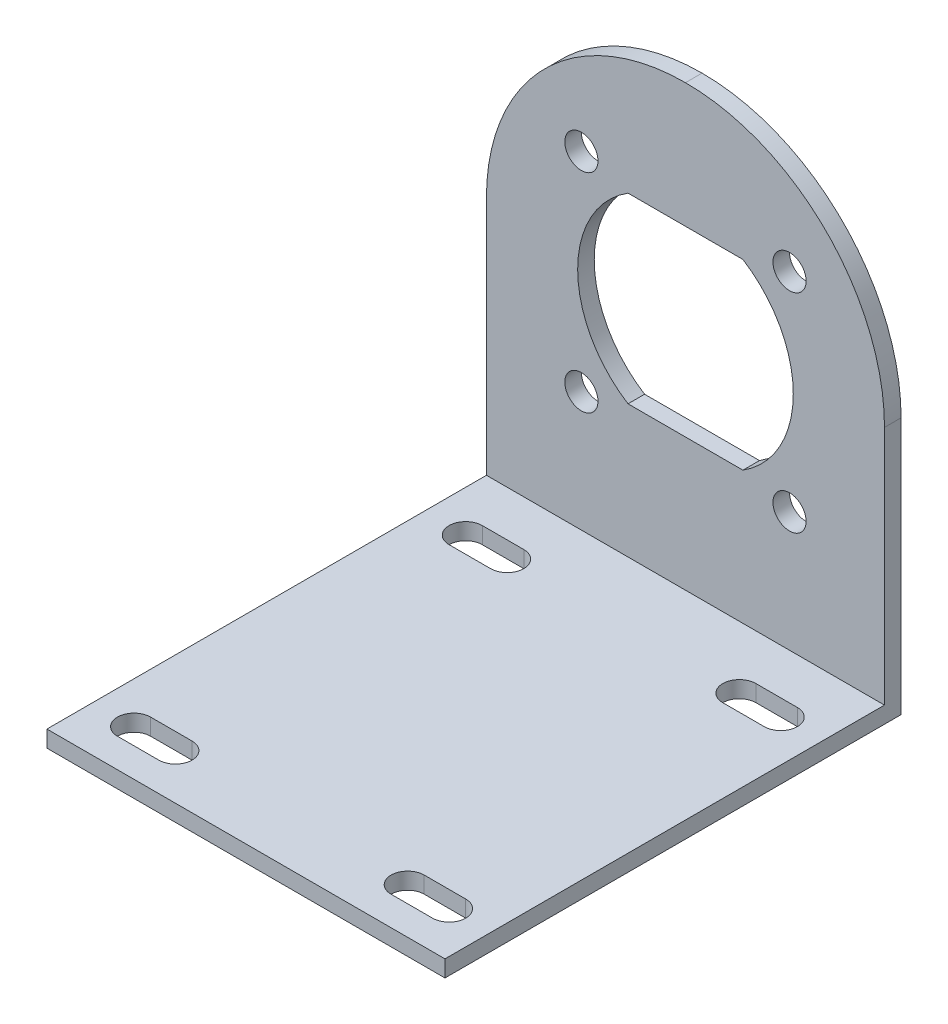
ISO-10303-21;
HEADER;
FILE_DESCRIPTION(('STEP AP214'),'2;1');
FILE_NAME('part.step','',(''),(''),'','','');
FILE_SCHEMA(('AUTOMOTIVE_DESIGN { 1 0 10303 214 1 1 1 1 }'));
ENDSEC;
DATA;
#1=APPLICATION_CONTEXT('core data for automotive mechanical design processes');
#2=APPLICATION_PROTOCOL_DEFINITION('international standard','automotive_design',2000,#1);
#3=PRODUCT_CONTEXT('',#1,'mechanical');
#4=PRODUCT('Part','Part','',(#3));
#5=PRODUCT_RELATED_PRODUCT_CATEGORY('part','',(#4));
#6=PRODUCT_DEFINITION_FORMATION('','',#4);
#7=PRODUCT_DEFINITION_CONTEXT('part definition',#1,'design');
#8=PRODUCT_DEFINITION('design','',#6,#7);
#9=PRODUCT_DEFINITION_SHAPE('','',#8);
#10=(LENGTH_UNIT() NAMED_UNIT(*) SI_UNIT(.MILLI.,.METRE.));
#11=(NAMED_UNIT(*) PLANE_ANGLE_UNIT() SI_UNIT($,.RADIAN.));
#12=(NAMED_UNIT(*) SI_UNIT($,.STERADIAN.) SOLID_ANGLE_UNIT());
#13=UNCERTAINTY_MEASURE_WITH_UNIT(LENGTH_MEASURE(1.E-05),#10,'distance_accuracy_value','');
#14=(GEOMETRIC_REPRESENTATION_CONTEXT(3) GLOBAL_UNCERTAINTY_ASSIGNED_CONTEXT((#13)) GLOBAL_UNIT_ASSIGNED_CONTEXT((#10,
#11,#12)) REPRESENTATION_CONTEXT('',''));
#15=CARTESIAN_POINT('',(0.,0.,0.));
#16=DIRECTION('',(0.,0.,1.));
#17=DIRECTION('',(1.,0.,0.));
#18=AXIS2_PLACEMENT_3D('',#15,#16,#17);
#19=CARTESIAN_POINT('',(0.,1.99999999999999,-24.));
#20=DIRECTION('',(0.,0.,-1.));
#21=DIRECTION('',(-1.,0.,0.));
#22=AXIS2_PLACEMENT_3D('',#19,#20,#21);
#23=PLANE('',#22);
#24=CARTESIAN_POINT('',(0.,29.,-24.));
#25=DIRECTION('',(0.,0.,1.));
#26=DIRECTION('',(1.,0.,0.));
#27=AXIS2_PLACEMENT_3D('',#24,#25,#26);
#28=CIRCLE('',#27,13.);
#29=CARTESIAN_POINT('',(-6.92820323027552,40.,-24.));
#30=VERTEX_POINT('',#29);
#31=CARTESIAN_POINT('',(-6.92820323027552,18.,-24.));
#32=VERTEX_POINT('',#31);
#33=EDGE_CURVE('E427',#30,#32,#28,.T.);
#34=ORIENTED_EDGE('',*,*,#33,.F.);
#35=DIRECTION('',(-1.,0.,0.));
#36=VECTOR('',#35,1.);
#37=CARTESIAN_POINT('',(0.,40.,-24.));
#38=LINE('',#37,#36);
#39=CARTESIAN_POINT('',(6.92820323027552,40.,-24.));
#40=VERTEX_POINT('',#39);
#41=EDGE_CURVE('E436',#40,#30,#38,.T.);
#42=ORIENTED_EDGE('',*,*,#41,.F.);
#43=CARTESIAN_POINT('',(0.,29.,-24.));
#44=DIRECTION('',(0.,0.,1.));
#45=DIRECTION('',(1.,0.,0.));
#46=AXIS2_PLACEMENT_3D('',#43,#44,#45);
#47=CIRCLE('',#46,13.);
#48=CARTESIAN_POINT('',(6.92820323027552,18.,-24.));
#49=VERTEX_POINT('',#48);
#50=EDGE_CURVE('E433',#49,#40,#47,.T.);
#51=ORIENTED_EDGE('',*,*,#50,.F.);
#52=DIRECTION('',(1.,0.,0.));
#53=VECTOR('',#52,1.);
#54=CARTESIAN_POINT('',(0.,18.,-24.));
#55=LINE('',#54,#53);
#56=EDGE_CURVE('E430',#32,#49,#55,.T.);
#57=ORIENTED_EDGE('',*,*,#56,.F.);
#58=EDGE_LOOP('',(#34,#42,#51,#57));
#59=FACE_BOUND('',#58,.T.);
#60=CARTESIAN_POINT('',(12.55,41.55,-24.));
#61=DIRECTION('',(0.,0.,1.));
#62=DIRECTION('',(1.,0.,0.));
#63=AXIS2_PLACEMENT_3D('',#60,#61,#62);
#64=CIRCLE('',#63,2.);
#65=CARTESIAN_POINT('',(14.55,41.55,-24.));
#66=VERTEX_POINT('',#65);
#67=EDGE_CURVE('E392',#66,#66,#64,.T.);
#68=ORIENTED_EDGE('',*,*,#67,.F.);
#69=EDGE_LOOP('',(#68));
#70=FACE_BOUND('',#69,.T.);
#71=CARTESIAN_POINT('',(-12.55,16.45,-24.));
#72=DIRECTION('',(0.,0.,1.));
#73=DIRECTION('',(1.,0.,0.));
#74=AXIS2_PLACEMENT_3D('',#71,#72,#73);
#75=CIRCLE('',#74,2.);
#76=CARTESIAN_POINT('',(-10.55,16.45,-24.));
#77=VERTEX_POINT('',#76);
#78=EDGE_CURVE('E385',#77,#77,#75,.T.);
#79=ORIENTED_EDGE('',*,*,#78,.F.);
#80=EDGE_LOOP('',(#79));
#81=FACE_BOUND('',#80,.T.);
#82=CARTESIAN_POINT('',(12.55,16.45,-24.));
#83=DIRECTION('',(0.,0.,1.));
#84=DIRECTION('',(1.,0.,0.));
#85=AXIS2_PLACEMENT_3D('',#82,#83,#84);
#86=CIRCLE('',#85,2.);
#87=CARTESIAN_POINT('',(14.55,16.45,-24.));
#88=VERTEX_POINT('',#87);
#89=EDGE_CURVE('E388',#88,#88,#86,.T.);
#90=ORIENTED_EDGE('',*,*,#89,.F.);
#91=EDGE_LOOP('',(#90));
#92=FACE_BOUND('',#91,.T.);
#93=CARTESIAN_POINT('',(-12.55,41.55,-24.));
#94=DIRECTION('',(0.,0.,1.));
#95=DIRECTION('',(1.,0.,0.));
#96=AXIS2_PLACEMENT_3D('',#93,#94,#95);
#97=CIRCLE('',#96,2.);
#98=CARTESIAN_POINT('',(-10.55,41.55,-24.));
#99=VERTEX_POINT('',#98);
#100=EDGE_CURVE('E389',#99,#99,#97,.T.);
#101=ORIENTED_EDGE('',*,*,#100,.F.);
#102=EDGE_LOOP('',(#101));
#103=FACE_BOUND('',#102,.T.);
#104=DIRECTION('',(0.,1.,0.));
#105=VECTOR('',#104,1.);
#106=CARTESIAN_POINT('',(24.,-108.,-24.));
#107=LINE('',#106,#105);
#108=CARTESIAN_POINT('',(24.,2.,-24.));
#109=VERTEX_POINT('',#108);
#110=CARTESIAN_POINT('',(24.,31.,-24.));
#111=VERTEX_POINT('',#110);
#112=EDGE_CURVE('E379',#109,#111,#107,.T.);
#113=ORIENTED_EDGE('',*,*,#112,.T.);
#114=CARTESIAN_POINT('',(0.,31.,-24.));
#115=DIRECTION('',(0.,0.,-1.));
#116=DIRECTION('',(-1.,0.,0.));
#117=AXIS2_PLACEMENT_3D('',#114,#115,#116);
#118=CIRCLE('',#117,24.);
#119=CARTESIAN_POINT('',(0.,55.,-24.));
#120=VERTEX_POINT('',#119);
#121=EDGE_CURVE('E11',#111,#120,#118,.F.);
#122=ORIENTED_EDGE('',*,*,#121,.T.);
#123=CARTESIAN_POINT('',(0.,31.,-24.));
#124=DIRECTION('',(0.,0.,-1.));
#125=DIRECTION('',(-1.,0.,0.));
#126=AXIS2_PLACEMENT_3D('',#123,#124,#125);
#127=CIRCLE('',#126,24.);
#128=CARTESIAN_POINT('',(-24.,31.,-24.));
#129=VERTEX_POINT('',#128);
#130=EDGE_CURVE('E447',#120,#129,#127,.F.);
#131=ORIENTED_EDGE('',*,*,#130,.T.);
#132=DIRECTION('',(0.,1.,0.));
#133=VECTOR('',#132,1.);
#134=CARTESIAN_POINT('',(-24.,-108.,-24.));
#135=LINE('',#134,#133);
#136=CARTESIAN_POINT('',(-24.,2.,-24.));
#137=VERTEX_POINT('',#136);
#138=EDGE_CURVE('E376',#137,#129,#135,.T.);
#139=ORIENTED_EDGE('',*,*,#138,.F.);
#140=DIRECTION('',(-1.,0.,0.));
#141=VECTOR('',#140,1.);
#142=CARTESIAN_POINT('',(-24.,2.,-24.));
#143=LINE('',#142,#141);
#144=EDGE_CURVE('E352',#109,#137,#143,.T.);
#145=ORIENTED_EDGE('',*,*,#144,.F.);
#146=EDGE_LOOP('',(#113,#122,#131,#139,#145));
#147=FACE_BOUND('',#146,.T.);
#148=ADVANCED_FACE('F33',(#59,#70,#81,#92,#103,#147),#23,.F.);
#149=CARTESIAN_POINT('',(0.,0.,0.));
#150=DIRECTION('',(0.,1.,0.));
#151=DIRECTION('',(0.,0.,1.));
#152=AXIS2_PLACEMENT_3D('',#149,#150,#151);
#153=PLANE('',#152);
#154=DIRECTION('',(1.,0.,0.));
#155=VECTOR('',#154,1.);
#156=CARTESIAN_POINT('',(0.,0.,25.5));
#157=LINE('',#156,#155);
#158=CARTESIAN_POINT('',(14.,0.,25.5));
#159=VERTEX_POINT('',#158);
#160=CARTESIAN_POINT('',(19.,0.,25.5));
#161=VERTEX_POINT('',#160);
#162=EDGE_CURVE('E346',#159,#161,#157,.T.);
#163=ORIENTED_EDGE('',*,*,#162,.T.);
#164=CARTESIAN_POINT('',(19.,0.,23.5));
#165=DIRECTION('',(0.,1.,0.));
#166=DIRECTION('',(0.,0.,1.));
#167=AXIS2_PLACEMENT_3D('',#164,#165,#166);
#168=CIRCLE('',#167,2.);
#169=CARTESIAN_POINT('',(19.,0.,21.5));
#170=VERTEX_POINT('',#169);
#171=EDGE_CURVE('E349',#161,#170,#168,.T.);
#172=ORIENTED_EDGE('',*,*,#171,.T.);
#173=DIRECTION('',(-1.,0.,0.));
#174=VECTOR('',#173,1.);
#175=CARTESIAN_POINT('',(0.,0.,21.5));
#176=LINE('',#175,#174);
#177=CARTESIAN_POINT('',(14.,0.,21.5));
#178=VERTEX_POINT('',#177);
#179=EDGE_CURVE('E340',#170,#178,#176,.T.);
#180=ORIENTED_EDGE('',*,*,#179,.T.);
#181=CARTESIAN_POINT('',(14.,0.,23.5));
#182=DIRECTION('',(0.,1.,0.));
#183=DIRECTION('',(0.,0.,1.));
#184=AXIS2_PLACEMENT_3D('',#181,#182,#183);
#185=CIRCLE('',#184,2.);
#186=EDGE_CURVE('E343',#178,#159,#185,.T.);
#187=ORIENTED_EDGE('',*,*,#186,.T.);
#188=EDGE_LOOP('',(#163,#172,#180,#187));
#189=FACE_BOUND('',#188,.T.);
#190=DIRECTION('',(-1.,0.,0.));
#191=VECTOR('',#190,1.);
#192=CARTESIAN_POINT('',(0.,0.,21.5));
#193=LINE('',#192,#191);
#194=CARTESIAN_POINT('',(-14.,0.,21.5));
#195=VERTEX_POINT('',#194);
#196=CARTESIAN_POINT('',(-19.,0.,21.5));
#197=VERTEX_POINT('',#196);
#198=EDGE_CURVE('E334',#195,#197,#193,.T.);
#199=ORIENTED_EDGE('',*,*,#198,.T.);
#200=CARTESIAN_POINT('',(-19.,0.,23.5));
#201=DIRECTION('',(0.,1.,0.));
#202=DIRECTION('',(0.,0.,1.));
#203=AXIS2_PLACEMENT_3D('',#200,#201,#202);
#204=CIRCLE('',#203,2.);
#205=CARTESIAN_POINT('',(-19.,0.,25.5));
#206=VERTEX_POINT('',#205);
#207=EDGE_CURVE('E337',#197,#206,#204,.T.);
#208=ORIENTED_EDGE('',*,*,#207,.T.);
#209=DIRECTION('',(1.,0.,0.));
#210=VECTOR('',#209,1.);
#211=CARTESIAN_POINT('',(0.,0.,25.5));
#212=LINE('',#211,#210);
#213=CARTESIAN_POINT('',(-14.,0.,25.5));
#214=VERTEX_POINT('',#213);
#215=EDGE_CURVE('E328',#206,#214,#212,.T.);
#216=ORIENTED_EDGE('',*,*,#215,.T.);
#217=CARTESIAN_POINT('',(-14.,0.,23.5));
#218=DIRECTION('',(0.,1.,0.));
#219=DIRECTION('',(0.,0.,1.));
#220=AXIS2_PLACEMENT_3D('',#217,#218,#219);
#221=CIRCLE('',#220,2.);
#222=EDGE_CURVE('E331',#214,#195,#221,.T.);
#223=ORIENTED_EDGE('',*,*,#222,.T.);
#224=EDGE_LOOP('',(#199,#208,#216,#223));
#225=FACE_BOUND('',#224,.T.);
#226=DIRECTION('',(-1.,0.,0.));
#227=VECTOR('',#226,1.);
#228=CARTESIAN_POINT('',(0.,0.,-18.5));
#229=LINE('',#228,#227);
#230=CARTESIAN_POINT('',(-14.,0.,-18.5));
#231=VERTEX_POINT('',#230);
#232=CARTESIAN_POINT('',(-19.,0.,-18.5));
#233=VERTEX_POINT('',#232);
#234=EDGE_CURVE('E322',#231,#233,#229,.T.);
#235=ORIENTED_EDGE('',*,*,#234,.T.);
#236=CARTESIAN_POINT('',(-19.,0.,-16.5));
#237=DIRECTION('',(0.,1.,0.));
#238=DIRECTION('',(0.,0.,1.));
#239=AXIS2_PLACEMENT_3D('',#236,#237,#238);
#240=CIRCLE('',#239,1.99999999999999);
#241=CARTESIAN_POINT('',(-19.,0.,-14.5));
#242=VERTEX_POINT('',#241);
#243=EDGE_CURVE('E325',#233,#242,#240,.T.);
#244=ORIENTED_EDGE('',*,*,#243,.T.);
#245=DIRECTION('',(1.,0.,0.));
#246=VECTOR('',#245,1.);
#247=CARTESIAN_POINT('',(0.,0.,-14.5));
#248=LINE('',#247,#246);
#249=CARTESIAN_POINT('',(-14.,0.,-14.5));
#250=VERTEX_POINT('',#249);
#251=EDGE_CURVE('E319',#242,#250,#248,.T.);
#252=ORIENTED_EDGE('',*,*,#251,.T.);
#253=CARTESIAN_POINT('',(-14.,0.,-16.5));
#254=DIRECTION('',(0.,1.,0.));
#255=DIRECTION('',(0.,0.,1.));
#256=AXIS2_PLACEMENT_3D('',#253,#254,#255);
#257=CIRCLE('',#256,1.99999999999999);
#258=EDGE_CURVE('E220',#250,#231,#257,.T.);
#259=ORIENTED_EDGE('',*,*,#258,.T.);
#260=EDGE_LOOP('',(#235,#244,#252,#259));
#261=FACE_BOUND('',#260,.T.);
#262=DIRECTION('',(1.,0.,0.));
#263=VECTOR('',#262,1.);
#264=CARTESIAN_POINT('',(0.,0.,-14.5));
#265=LINE('',#264,#263);
#266=CARTESIAN_POINT('',(14.,0.,-14.5));
#267=VERTEX_POINT('',#266);
#268=CARTESIAN_POINT('',(19.,0.,-14.5));
#269=VERTEX_POINT('',#268);
#270=EDGE_CURVE('E313',#267,#269,#265,.T.);
#271=ORIENTED_EDGE('',*,*,#270,.T.);
#272=CARTESIAN_POINT('',(19.,0.,-16.5));
#273=DIRECTION('',(0.,1.,0.));
#274=DIRECTION('',(0.,0.,1.));
#275=AXIS2_PLACEMENT_3D('',#272,#273,#274);
#276=CIRCLE('',#275,1.99999999999999);
#277=CARTESIAN_POINT('',(19.,0.,-18.5));
#278=VERTEX_POINT('',#277);
#279=EDGE_CURVE('E316',#269,#278,#276,.T.);
#280=ORIENTED_EDGE('',*,*,#279,.T.);
#281=DIRECTION('',(-1.,0.,0.));
#282=VECTOR('',#281,1.);
#283=CARTESIAN_POINT('',(0.,0.,-18.5));
#284=LINE('',#283,#282);
#285=CARTESIAN_POINT('',(14.,0.,-18.5));
#286=VERTEX_POINT('',#285);
#287=EDGE_CURVE('E301',#278,#286,#284,.T.);
#288=ORIENTED_EDGE('',*,*,#287,.T.);
#289=CARTESIAN_POINT('',(14.,0.,-16.5));
#290=DIRECTION('',(0.,1.,0.));
#291=DIRECTION('',(0.,0.,1.));
#292=AXIS2_PLACEMENT_3D('',#289,#290,#291);
#293=CIRCLE('',#292,1.99999999999999);
#294=EDGE_CURVE('E310',#286,#267,#293,.T.);
#295=ORIENTED_EDGE('',*,*,#294,.T.);
#296=EDGE_LOOP('',(#271,#280,#288,#295));
#297=FACE_BOUND('',#296,.T.);
#298=DIRECTION('',(0.,0.,1.));
#299=VECTOR('',#298,1.);
#300=CARTESIAN_POINT('',(-24.,0.,0.));
#301=LINE('',#300,#299);
#302=CARTESIAN_POINT('',(-24.,0.,-26.));
#303=VERTEX_POINT('',#302);
#304=CARTESIAN_POINT('',(-24.,0.,29.));
#305=VERTEX_POINT('',#304);
#306=EDGE_CURVE('E383',#303,#305,#301,.T.);
#307=ORIENTED_EDGE('',*,*,#306,.F.);
#308=DIRECTION('',(-1.,0.,0.));
#309=VECTOR('',#308,1.);
#310=CARTESIAN_POINT('',(25.,0.,-26.));
#311=LINE('',#310,#309);
#312=CARTESIAN_POINT('',(24.,0.,-26.));
#313=VERTEX_POINT('',#312);
#314=EDGE_CURVE('E410',#313,#303,#311,.T.);
#315=ORIENTED_EDGE('',*,*,#314,.F.);
#316=DIRECTION('',(0.,0.,-1.));
#317=VECTOR('',#316,1.);
#318=CARTESIAN_POINT('',(24.,0.,0.));
#319=LINE('',#318,#317);
#320=CARTESIAN_POINT('',(24.,0.,29.));
#321=VERTEX_POINT('',#320);
#322=EDGE_CURVE('E375',#321,#313,#319,.T.);
#323=ORIENTED_EDGE('',*,*,#322,.F.);
#324=DIRECTION('',(1.,0.,0.));
#325=VECTOR('',#324,1.);
#326=CARTESIAN_POINT('',(-24.,0.,29.));
#327=LINE('',#326,#325);
#328=EDGE_CURVE('E356',#305,#321,#327,.T.);
#329=ORIENTED_EDGE('',*,*,#328,.F.);
#330=EDGE_LOOP('',(#307,#315,#323,#329));
#331=FACE_BOUND('',#330,.T.);
#332=ADVANCED_FACE('F476',(#189,#225,#261,#297,#331),#153,.F.);
#333=CARTESIAN_POINT('',(25.,52.,-26.));
#334=DIRECTION('',(0.,0.,1.));
#335=DIRECTION('',(1.,0.,0.));
#336=AXIS2_PLACEMENT_3D('',#333,#334,#335);
#337=PLANE('',#336);
#338=CARTESIAN_POINT('',(-12.55,41.55,-26.));
#339=DIRECTION('',(0.,0.,1.));
#340=DIRECTION('',(1.,0.,0.));
#341=AXIS2_PLACEMENT_3D('',#338,#339,#340);
#342=CIRCLE('',#341,2.);
#343=CARTESIAN_POINT('',(-10.55,41.55,-26.));
#344=VERTEX_POINT('',#343);
#345=EDGE_CURVE('E406',#344,#344,#342,.T.);
#346=ORIENTED_EDGE('',*,*,#345,.T.);
#347=EDGE_LOOP('',(#346));
#348=FACE_BOUND('',#347,.T.);
#349=CARTESIAN_POINT('',(12.55,16.45,-26.));
#350=DIRECTION('',(0.,0.,1.));
#351=DIRECTION('',(1.,0.,0.));
#352=AXIS2_PLACEMENT_3D('',#349,#350,#351);
#353=CIRCLE('',#352,2.);
#354=CARTESIAN_POINT('',(14.55,16.45,-26.));
#355=VERTEX_POINT('',#354);
#356=EDGE_CURVE('E403',#355,#355,#353,.T.);
#357=ORIENTED_EDGE('',*,*,#356,.T.);
#358=EDGE_LOOP('',(#357));
#359=FACE_BOUND('',#358,.T.);
#360=CARTESIAN_POINT('',(-12.55,16.45,-26.));
#361=DIRECTION('',(0.,0.,1.));
#362=DIRECTION('',(1.,0.,0.));
#363=AXIS2_PLACEMENT_3D('',#360,#361,#362);
#364=CIRCLE('',#363,2.);
#365=CARTESIAN_POINT('',(-10.55,16.45,-26.));
#366=VERTEX_POINT('',#365);
#367=EDGE_CURVE('E400',#366,#366,#364,.T.);
#368=ORIENTED_EDGE('',*,*,#367,.T.);
#369=EDGE_LOOP('',(#368));
#370=FACE_BOUND('',#369,.T.);
#371=CARTESIAN_POINT('',(12.55,41.55,-26.));
#372=DIRECTION('',(0.,0.,1.));
#373=DIRECTION('',(1.,0.,0.));
#374=AXIS2_PLACEMENT_3D('',#371,#372,#373);
#375=CIRCLE('',#374,2.);
#376=CARTESIAN_POINT('',(14.55,41.55,-26.));
#377=VERTEX_POINT('',#376);
#378=EDGE_CURVE('E397',#377,#377,#375,.T.);
#379=ORIENTED_EDGE('',*,*,#378,.T.);
#380=EDGE_LOOP('',(#379));
#381=FACE_BOUND('',#380,.T.);
#382=CARTESIAN_POINT('',(0.,29.,-26.));
#383=DIRECTION('',(0.,0.,1.));
#384=DIRECTION('',(1.,0.,0.));
#385=AXIS2_PLACEMENT_3D('',#382,#383,#384);
#386=CIRCLE('',#385,13.);
#387=CARTESIAN_POINT('',(6.92820323027552,18.,-26.));
#388=VERTEX_POINT('',#387);
#389=CARTESIAN_POINT('',(6.92820323027552,40.,-26.));
#390=VERTEX_POINT('',#389);
#391=EDGE_CURVE('E409',#388,#390,#386,.T.);
#392=ORIENTED_EDGE('',*,*,#391,.T.);
#393=DIRECTION('',(-1.,0.,0.));
#394=VECTOR('',#393,1.);
#395=CARTESIAN_POINT('',(25.,40.,-26.));
#396=LINE('',#395,#394);
#397=CARTESIAN_POINT('',(-6.92820323027552,40.,-26.));
#398=VERTEX_POINT('',#397);
#399=EDGE_CURVE('E415',#390,#398,#396,.T.);
#400=ORIENTED_EDGE('',*,*,#399,.T.);
#401=CARTESIAN_POINT('',(0.,29.,-26.));
#402=DIRECTION('',(0.,0.,1.));
#403=DIRECTION('',(1.,0.,0.));
#404=AXIS2_PLACEMENT_3D('',#401,#402,#403);
#405=CIRCLE('',#404,13.);
#406=CARTESIAN_POINT('',(-6.92820323027552,18.,-26.));
#407=VERTEX_POINT('',#406);
#408=EDGE_CURVE('E418',#398,#407,#405,.T.);
#409=ORIENTED_EDGE('',*,*,#408,.T.);
#410=DIRECTION('',(1.,0.,0.));
#411=VECTOR('',#410,1.);
#412=CARTESIAN_POINT('',(25.,18.,-26.));
#413=LINE('',#412,#411);
#414=EDGE_CURVE('E414',#407,#388,#413,.T.);
#415=ORIENTED_EDGE('',*,*,#414,.T.);
#416=EDGE_LOOP('',(#392,#400,#409,#415));
#417=FACE_BOUND('',#416,.T.);
#418=CARTESIAN_POINT('',(0.,31.,-26.));
#419=DIRECTION('',(0.,0.,1.));
#420=DIRECTION('',(1.,0.,0.));
#421=AXIS2_PLACEMENT_3D('',#418,#419,#420);
#422=CIRCLE('',#421,24.);
#423=CARTESIAN_POINT('',(-24.,31.,-26.));
#424=VERTEX_POINT('',#423);
#425=CARTESIAN_POINT('',(0.,55.,-26.));
#426=VERTEX_POINT('',#425);
#427=EDGE_CURVE('E451',#424,#426,#422,.F.);
#428=ORIENTED_EDGE('',*,*,#427,.T.);
#429=CARTESIAN_POINT('',(0.,31.,-26.));
#430=DIRECTION('',(0.,0.,1.));
#431=DIRECTION('',(1.,0.,0.));
#432=AXIS2_PLACEMENT_3D('',#429,#430,#431);
#433=CIRCLE('',#432,24.);
#434=CARTESIAN_POINT('',(24.,31.,-26.));
#435=VERTEX_POINT('',#434);
#436=EDGE_CURVE('E55',#426,#435,#433,.F.);
#437=ORIENTED_EDGE('',*,*,#436,.T.);
#438=DIRECTION('',(0.,1.,0.));
#439=VECTOR('',#438,1.);
#440=CARTESIAN_POINT('',(24.,-108.,-26.));
#441=LINE('',#440,#439);
#442=EDGE_CURVE('E371',#313,#435,#441,.T.);
#443=ORIENTED_EDGE('',*,*,#442,.F.);
#444=ORIENTED_EDGE('',*,*,#314,.T.);
#445=DIRECTION('',(0.,1.,0.));
#446=VECTOR('',#445,1.);
#447=CARTESIAN_POINT('',(-24.,-108.,-26.));
#448=LINE('',#447,#446);
#449=EDGE_CURVE('E372',#303,#424,#448,.T.);
#450=ORIENTED_EDGE('',*,*,#449,.T.);
#451=EDGE_LOOP('',(#428,#437,#443,#444,#450));
#452=FACE_BOUND('',#451,.T.);
#453=ADVANCED_FACE('F455',(#348,#359,#370,#381,#417,#452),#337,.F.);
#454=CARTESIAN_POINT('',(0.,29.,-74.));
#455=DIRECTION('',(0.,0.,1.));
#456=DIRECTION('',(1.,0.,0.));
#457=AXIS2_PLACEMENT_3D('',#454,#455,#456);
#458=CYLINDRICAL_SURFACE('',#457,13.);
#459=DIRECTION('',(0.,0.,1.));
#460=VECTOR('',#459,1.);
#461=CARTESIAN_POINT('',(-6.92820323027552,40.,-74.));
#462=LINE('',#461,#460);
#463=EDGE_CURVE('E413',#398,#30,#462,.T.);
#464=ORIENTED_EDGE('',*,*,#463,.T.);
#465=ORIENTED_EDGE('',*,*,#33,.T.);
#466=DIRECTION('',(0.,0.,1.));
#467=VECTOR('',#466,1.);
#468=CARTESIAN_POINT('',(-6.92820323027552,18.,-74.));
#469=LINE('',#468,#467);
#470=EDGE_CURVE('E428',#407,#32,#469,.T.);
#471=ORIENTED_EDGE('',*,*,#470,.F.);
#472=ORIENTED_EDGE('',*,*,#408,.F.);
#473=EDGE_LOOP('',(#464,#465,#471,#472));
#474=FACE_BOUND('',#473,.T.);
#475=ADVANCED_FACE('F507',(#474),#458,.F.);
#476=CARTESIAN_POINT('',(0.,18.,-74.));
#477=DIRECTION('',(0.,-1.,0.));
#478=DIRECTION('',(0.,0.,-1.));
#479=AXIS2_PLACEMENT_3D('',#476,#477,#478);
#480=PLANE('',#479);
#481=ORIENTED_EDGE('',*,*,#470,.T.);
#482=ORIENTED_EDGE('',*,*,#56,.T.);
#483=DIRECTION('',(0.,0.,1.));
#484=VECTOR('',#483,1.);
#485=CARTESIAN_POINT('',(6.92820323027552,18.,-74.));
#486=LINE('',#485,#484);
#487=EDGE_CURVE('E431',#388,#49,#486,.T.);
#488=ORIENTED_EDGE('',*,*,#487,.F.);
#489=ORIENTED_EDGE('',*,*,#414,.F.);
#490=EDGE_LOOP('',(#481,#482,#488,#489));
#491=FACE_BOUND('',#490,.T.);
#492=ADVANCED_FACE('F808',(#491),#480,.F.);
#493=CARTESIAN_POINT('',(0.,29.,-74.));
#494=DIRECTION('',(0.,0.,1.));
#495=DIRECTION('',(1.,0.,0.));
#496=AXIS2_PLACEMENT_3D('',#493,#494,#495);
#497=CYLINDRICAL_SURFACE('',#496,13.);
#498=ORIENTED_EDGE('',*,*,#487,.T.);
#499=ORIENTED_EDGE('',*,*,#50,.T.);
#500=DIRECTION('',(0.,0.,1.));
#501=VECTOR('',#500,1.);
#502=CARTESIAN_POINT('',(6.92820323027552,40.,-74.));
#503=LINE('',#502,#501);
#504=EDGE_CURVE('E434',#390,#40,#503,.T.);
#505=ORIENTED_EDGE('',*,*,#504,.F.);
#506=ORIENTED_EDGE('',*,*,#391,.F.);
#507=EDGE_LOOP('',(#498,#499,#505,#506));
#508=FACE_BOUND('',#507,.T.);
#509=ADVANCED_FACE('F505',(#508),#497,.F.);
#510=CARTESIAN_POINT('',(0.,40.,-74.));
#511=DIRECTION('',(0.,1.,0.));
#512=DIRECTION('',(0.,0.,1.));
#513=AXIS2_PLACEMENT_3D('',#510,#511,#512);
#514=PLANE('',#513);
#515=ORIENTED_EDGE('',*,*,#504,.T.);
#516=ORIENTED_EDGE('',*,*,#41,.T.);
#517=ORIENTED_EDGE('',*,*,#463,.F.);
#518=ORIENTED_EDGE('',*,*,#399,.F.);
#519=EDGE_LOOP('',(#515,#516,#517,#518));
#520=FACE_BOUND('',#519,.T.);
#521=ADVANCED_FACE('F789',(#520),#514,.F.);
#522=CARTESIAN_POINT('',(12.55,41.55,-74.));
#523=DIRECTION('',(0.,0.,1.));
#524=DIRECTION('',(1.,0.,0.));
#525=AXIS2_PLACEMENT_3D('',#522,#523,#524);
#526=CYLINDRICAL_SURFACE('',#525,2.);
#527=ORIENTED_EDGE('',*,*,#67,.T.);
#528=EDGE_LOOP('',(#527));
#529=FACE_BOUND('',#528,.T.);
#530=ORIENTED_EDGE('',*,*,#378,.F.);
#531=EDGE_LOOP('',(#530));
#532=FACE_BOUND('',#531,.T.);
#533=ADVANCED_FACE('F779',(#529,#532),#526,.F.);
#534=CARTESIAN_POINT('',(-12.55,16.45,-74.));
#535=DIRECTION('',(0.,0.,1.));
#536=DIRECTION('',(1.,0.,0.));
#537=AXIS2_PLACEMENT_3D('',#534,#535,#536);
#538=CYLINDRICAL_SURFACE('',#537,2.);
#539=ORIENTED_EDGE('',*,*,#78,.T.);
#540=EDGE_LOOP('',(#539));
#541=FACE_BOUND('',#540,.T.);
#542=ORIENTED_EDGE('',*,*,#367,.F.);
#543=EDGE_LOOP('',(#542));
#544=FACE_BOUND('',#543,.T.);
#545=ADVANCED_FACE('F769',(#541,#544),#538,.F.);
#546=CARTESIAN_POINT('',(12.55,16.45,-74.));
#547=DIRECTION('',(0.,0.,1.));
#548=DIRECTION('',(1.,0.,0.));
#549=AXIS2_PLACEMENT_3D('',#546,#547,#548);
#550=CYLINDRICAL_SURFACE('',#549,2.);
#551=ORIENTED_EDGE('',*,*,#89,.T.);
#552=EDGE_LOOP('',(#551));
#553=FACE_BOUND('',#552,.T.);
#554=ORIENTED_EDGE('',*,*,#356,.F.);
#555=EDGE_LOOP('',(#554));
#556=FACE_BOUND('',#555,.T.);
#557=ADVANCED_FACE('F489',(#553,#556),#550,.F.);
#558=CARTESIAN_POINT('',(-12.55,41.55,-74.));
#559=DIRECTION('',(0.,0.,1.));
#560=DIRECTION('',(1.,0.,0.));
#561=AXIS2_PLACEMENT_3D('',#558,#559,#560);
#562=CYLINDRICAL_SURFACE('',#561,2.);
#563=ORIENTED_EDGE('',*,*,#100,.T.);
#564=EDGE_LOOP('',(#563));
#565=FACE_BOUND('',#564,.T.);
#566=ORIENTED_EDGE('',*,*,#345,.F.);
#567=EDGE_LOOP('',(#566));
#568=FACE_BOUND('',#567,.T.);
#569=ADVANCED_FACE('F480',(#565,#568),#562,.F.);
#570=CARTESIAN_POINT('',(-24.,-108.,0.));
#571=DIRECTION('',(-1.,0.,0.));
#572=DIRECTION('',(0.,0.,1.));
#573=AXIS2_PLACEMENT_3D('',#570,#571,#572);
#574=PLANE('',#573);
#575=ORIENTED_EDGE('',*,*,#138,.T.);
#576=DIRECTION('',(0.,0.,1.));
#577=VECTOR('',#576,1.);
#578=CARTESIAN_POINT('',(-24.,31.,0.));
#579=LINE('',#578,#577);
#580=EDGE_CURVE('E449',#129,#424,#579,.F.);
#581=ORIENTED_EDGE('',*,*,#580,.T.);
#582=ORIENTED_EDGE('',*,*,#449,.F.);
#583=ORIENTED_EDGE('',*,*,#306,.T.);
#584=DIRECTION('',(0.,-1.,0.));
#585=VECTOR('',#584,1.);
#586=CARTESIAN_POINT('',(-24.,0.,29.));
#587=LINE('',#586,#585);
#588=CARTESIAN_POINT('',(-24.,2.,29.));
#589=VERTEX_POINT('',#588);
#590=EDGE_CURVE('E353',#589,#305,#587,.T.);
#591=ORIENTED_EDGE('',*,*,#590,.F.);
#592=DIRECTION('',(0.,0.,-1.));
#593=VECTOR('',#592,1.);
#594=CARTESIAN_POINT('',(-24.,2.,29.));
#595=LINE('',#594,#593);
#596=EDGE_CURVE('E363',#589,#137,#595,.T.);
#597=ORIENTED_EDGE('',*,*,#596,.T.);
#598=EDGE_LOOP('',(#575,#581,#582,#583,#591,#597));
#599=FACE_BOUND('',#598,.T.);
#600=ADVANCED_FACE('F478',(#599),#574,.T.);
#601=CARTESIAN_POINT('',(24.,-108.,0.));
#602=DIRECTION('',(1.,0.,0.));
#603=DIRECTION('',(0.,0.,-1.));
#604=AXIS2_PLACEMENT_3D('',#601,#602,#603);
#605=PLANE('',#604);
#606=ORIENTED_EDGE('',*,*,#442,.T.);
#607=DIRECTION('',(0.,0.,-1.));
#608=VECTOR('',#607,1.);
#609=CARTESIAN_POINT('',(24.,31.,0.));
#610=LINE('',#609,#608);
#611=EDGE_CURVE('E41',#435,#111,#610,.F.);
#612=ORIENTED_EDGE('',*,*,#611,.T.);
#613=ORIENTED_EDGE('',*,*,#112,.F.);
#614=DIRECTION('',(0.,0.,-1.));
#615=VECTOR('',#614,1.);
#616=CARTESIAN_POINT('',(24.,2.,29.));
#617=LINE('',#616,#615);
#618=CARTESIAN_POINT('',(24.,2.,29.));
#619=VERTEX_POINT('',#618);
#620=EDGE_CURVE('E368',#619,#109,#617,.T.);
#621=ORIENTED_EDGE('',*,*,#620,.F.);
#622=DIRECTION('',(0.,1.,0.));
#623=VECTOR('',#622,1.);
#624=CARTESIAN_POINT('',(24.,0.,29.));
#625=LINE('',#624,#623);
#626=EDGE_CURVE('E359',#321,#619,#625,.T.);
#627=ORIENTED_EDGE('',*,*,#626,.F.);
#628=ORIENTED_EDGE('',*,*,#322,.T.);
#629=EDGE_LOOP('',(#606,#612,#613,#621,#627,#628));
#630=FACE_BOUND('',#629,.T.);
#631=ADVANCED_FACE('F464',(#630),#605,.T.);
#632=CARTESIAN_POINT('',(-24.,2.,29.));
#633=DIRECTION('',(0.,-1.,0.));
#634=DIRECTION('',(0.,0.,-1.));
#635=AXIS2_PLACEMENT_3D('',#632,#633,#634);
#636=PLANE('',#635);
#637=DIRECTION('',(-1.,0.,0.));
#638=VECTOR('',#637,1.);
#639=CARTESIAN_POINT('',(19.,2.,21.5));
#640=LINE('',#639,#638);
#641=CARTESIAN_POINT('',(19.,2.,21.5));
#642=VERTEX_POINT('',#641);
#643=CARTESIAN_POINT('',(14.,2.,21.5));
#644=VERTEX_POINT('',#643);
#645=EDGE_CURVE('E271',#642,#644,#640,.T.);
#646=ORIENTED_EDGE('',*,*,#645,.F.);
#647=CARTESIAN_POINT('',(19.,2.,23.5));
#648=DIRECTION('',(0.,1.,0.));
#649=DIRECTION('',(0.,0.,-1.));
#650=AXIS2_PLACEMENT_3D('',#647,#648,#649);
#651=CIRCLE('',#650,2.);
#652=CARTESIAN_POINT('',(19.,2.,25.5));
#653=VERTEX_POINT('',#652);
#654=EDGE_CURVE('E269',#653,#642,#651,.T.);
#655=ORIENTED_EDGE('',*,*,#654,.F.);
#656=DIRECTION('',(1.,0.,0.));
#657=VECTOR('',#656,1.);
#658=CARTESIAN_POINT('',(19.,2.,25.5));
#659=LINE('',#658,#657);
#660=CARTESIAN_POINT('',(14.,2.,25.5));
#661=VERTEX_POINT('',#660);
#662=EDGE_CURVE('E277',#661,#653,#659,.T.);
#663=ORIENTED_EDGE('',*,*,#662,.F.);
#664=CARTESIAN_POINT('',(14.,2.,23.5));
#665=DIRECTION('',(0.,1.,0.));
#666=DIRECTION('',(0.,0.,-1.));
#667=AXIS2_PLACEMENT_3D('',#664,#665,#666);
#668=CIRCLE('',#667,2.);
#669=EDGE_CURVE('E274',#644,#661,#668,.T.);
#670=ORIENTED_EDGE('',*,*,#669,.F.);
#671=EDGE_LOOP('',(#646,#655,#663,#670));
#672=FACE_BOUND('',#671,.T.);
#673=DIRECTION('',(1.,0.,0.));
#674=VECTOR('',#673,1.);
#675=CARTESIAN_POINT('',(-19.,2.,25.5));
#676=LINE('',#675,#674);
#677=CARTESIAN_POINT('',(-19.,2.,25.5));
#678=VERTEX_POINT('',#677);
#679=CARTESIAN_POINT('',(-14.,2.,25.5));
#680=VERTEX_POINT('',#679);
#681=EDGE_CURVE('E250',#678,#680,#676,.T.);
#682=ORIENTED_EDGE('',*,*,#681,.F.);
#683=CARTESIAN_POINT('',(-19.,2.,23.5));
#684=DIRECTION('',(0.,1.,0.));
#685=DIRECTION('',(0.,0.,1.));
#686=AXIS2_PLACEMENT_3D('',#683,#684,#685);
#687=CIRCLE('',#686,2.);
#688=CARTESIAN_POINT('',(-19.,2.,21.5));
#689=VERTEX_POINT('',#688);
#690=EDGE_CURVE('E248',#689,#678,#687,.T.);
#691=ORIENTED_EDGE('',*,*,#690,.F.);
#692=DIRECTION('',(-1.,0.,0.));
#693=VECTOR('',#692,1.);
#694=CARTESIAN_POINT('',(-19.,2.,21.5));
#695=LINE('',#694,#693);
#696=CARTESIAN_POINT('',(-14.,2.,21.5));
#697=VERTEX_POINT('',#696);
#698=EDGE_CURVE('E257',#697,#689,#695,.T.);
#699=ORIENTED_EDGE('',*,*,#698,.F.);
#700=CARTESIAN_POINT('',(-14.,2.,23.5));
#701=DIRECTION('',(0.,1.,0.));
#702=DIRECTION('',(0.,0.,1.));
#703=AXIS2_PLACEMENT_3D('',#700,#701,#702);
#704=CIRCLE('',#703,2.);
#705=EDGE_CURVE('E254',#680,#697,#704,.T.);
#706=ORIENTED_EDGE('',*,*,#705,.F.);
#707=EDGE_LOOP('',(#682,#691,#699,#706));
#708=FACE_BOUND('',#707,.T.);
#709=DIRECTION('',(1.,0.,0.));
#710=VECTOR('',#709,1.);
#711=CARTESIAN_POINT('',(-19.,2.,-14.5));
#712=LINE('',#711,#710);
#713=CARTESIAN_POINT('',(-19.,2.,-14.5));
#714=VERTEX_POINT('',#713);
#715=CARTESIAN_POINT('',(-14.,2.,-14.5));
#716=VERTEX_POINT('',#715);
#717=EDGE_CURVE('E228',#714,#716,#712,.T.);
#718=ORIENTED_EDGE('',*,*,#717,.F.);
#719=CARTESIAN_POINT('',(-19.,2.,-16.5));
#720=DIRECTION('',(0.,1.,0.));
#721=DIRECTION('',(0.,0.,-1.));
#722=AXIS2_PLACEMENT_3D('',#719,#720,#721);
#723=CIRCLE('',#722,1.99999999999999);
#724=CARTESIAN_POINT('',(-19.,2.,-18.5));
#725=VERTEX_POINT('',#724);
#726=EDGE_CURVE('E233',#725,#714,#723,.T.);
#727=ORIENTED_EDGE('',*,*,#726,.F.);
#728=DIRECTION('',(-1.,0.,0.));
#729=VECTOR('',#728,1.);
#730=CARTESIAN_POINT('',(-19.,2.,-18.5));
#731=LINE('',#730,#729);
#732=CARTESIAN_POINT('',(-14.,2.,-18.5));
#733=VERTEX_POINT('',#732);
#734=EDGE_CURVE('E238',#733,#725,#731,.T.);
#735=ORIENTED_EDGE('',*,*,#734,.F.);
#736=CARTESIAN_POINT('',(-14.,2.,-16.5));
#737=DIRECTION('',(0.,1.,0.));
#738=DIRECTION('',(0.,0.,-1.));
#739=AXIS2_PLACEMENT_3D('',#736,#737,#738);
#740=CIRCLE('',#739,1.99999999999999);
#741=EDGE_CURVE('E217',#716,#733,#740,.T.);
#742=ORIENTED_EDGE('',*,*,#741,.F.);
#743=EDGE_LOOP('',(#718,#727,#735,#742));
#744=FACE_BOUND('',#743,.T.);
#745=DIRECTION('',(-1.,0.,0.));
#746=VECTOR('',#745,1.);
#747=CARTESIAN_POINT('',(19.,2.,-18.5));
#748=LINE('',#747,#746);
#749=CARTESIAN_POINT('',(19.,2.,-18.5));
#750=VERTEX_POINT('',#749);
#751=CARTESIAN_POINT('',(14.,2.,-18.5));
#752=VERTEX_POINT('',#751);
#753=EDGE_CURVE('E289',#750,#752,#748,.T.);
#754=ORIENTED_EDGE('',*,*,#753,.F.);
#755=CARTESIAN_POINT('',(19.,2.,-16.5));
#756=DIRECTION('',(0.,1.,0.));
#757=DIRECTION('',(0.,0.,1.));
#758=AXIS2_PLACEMENT_3D('',#755,#756,#757);
#759=CIRCLE('',#758,1.99999999999999);
#760=CARTESIAN_POINT('',(19.,2.,-14.5));
#761=VERTEX_POINT('',#760);
#762=EDGE_CURVE('E245',#761,#750,#759,.T.);
#763=ORIENTED_EDGE('',*,*,#762,.F.);
#764=DIRECTION('',(1.,0.,0.));
#765=VECTOR('',#764,1.);
#766=CARTESIAN_POINT('',(19.,2.,-14.5));
#767=LINE('',#766,#765);
#768=CARTESIAN_POINT('',(14.,2.,-14.5));
#769=VERTEX_POINT('',#768);
#770=EDGE_CURVE('E295',#769,#761,#767,.T.);
#771=ORIENTED_EDGE('',*,*,#770,.F.);
#772=CARTESIAN_POINT('',(14.,2.,-16.5));
#773=DIRECTION('',(0.,1.,0.));
#774=DIRECTION('',(0.,0.,1.));
#775=AXIS2_PLACEMENT_3D('',#772,#773,#774);
#776=CIRCLE('',#775,1.99999999999999);
#777=EDGE_CURVE('E292',#752,#769,#776,.T.);
#778=ORIENTED_EDGE('',*,*,#777,.F.);
#779=EDGE_LOOP('',(#754,#763,#771,#778));
#780=FACE_BOUND('',#779,.T.);
#781=ORIENTED_EDGE('',*,*,#144,.T.);
#782=ORIENTED_EDGE('',*,*,#596,.F.);
#783=DIRECTION('',(-1.,0.,0.));
#784=VECTOR('',#783,1.);
#785=CARTESIAN_POINT('',(-24.,2.,29.));
#786=LINE('',#785,#784);
#787=EDGE_CURVE('E361',#619,#589,#786,.T.);
#788=ORIENTED_EDGE('',*,*,#787,.F.);
#789=ORIENTED_EDGE('',*,*,#620,.T.);
#790=EDGE_LOOP('',(#781,#782,#788,#789));
#791=FACE_BOUND('',#790,.T.);
#792=ADVANCED_FACE('F235',(#672,#708,#744,#780,#791),#636,.F.);
#793=CARTESIAN_POINT('',(0.,0.,29.));
#794=DIRECTION('',(0.,0.,-1.));
#795=DIRECTION('',(-1.,0.,0.));
#796=AXIS2_PLACEMENT_3D('',#793,#794,#795);
#797=PLANE('',#796);
#798=ORIENTED_EDGE('',*,*,#590,.T.);
#799=ORIENTED_EDGE('',*,*,#328,.T.);
#800=ORIENTED_EDGE('',*,*,#626,.T.);
#801=ORIENTED_EDGE('',*,*,#787,.T.);
#802=EDGE_LOOP('',(#798,#799,#800,#801));
#803=FACE_BOUND('',#802,.T.);
#804=ADVANCED_FACE('F471',(#803),#797,.F.);
#805=CARTESIAN_POINT('',(19.,-51.,-16.5));
#806=DIRECTION('',(0.,1.,0.));
#807=DIRECTION('',(0.,0.,1.));
#808=AXIS2_PLACEMENT_3D('',#805,#806,#807);
#809=CYLINDRICAL_SURFACE('',#808,1.99999999999999);
#810=DIRECTION('',(0.,1.,0.));
#811=VECTOR('',#810,1.);
#812=CARTESIAN_POINT('',(19.,-51.,-14.5));
#813=LINE('',#812,#811);
#814=EDGE_CURVE('E299',#269,#761,#813,.T.);
#815=ORIENTED_EDGE('',*,*,#814,.T.);
#816=ORIENTED_EDGE('',*,*,#762,.T.);
#817=DIRECTION('',(0.,1.,0.));
#818=VECTOR('',#817,1.);
#819=CARTESIAN_POINT('',(19.,-51.,-18.5));
#820=LINE('',#819,#818);
#821=EDGE_CURVE('E298',#278,#750,#820,.T.);
#822=ORIENTED_EDGE('',*,*,#821,.F.);
#823=ORIENTED_EDGE('',*,*,#279,.F.);
#824=EDGE_LOOP('',(#815,#816,#822,#823));
#825=FACE_BOUND('',#824,.T.);
#826=ADVANCED_FACE('F534',(#825),#809,.F.);
#827=CARTESIAN_POINT('',(19.,-51.,-14.5));
#828=DIRECTION('',(0.,0.,1.));
#829=DIRECTION('',(1.,0.,0.));
#830=AXIS2_PLACEMENT_3D('',#827,#828,#829);
#831=PLANE('',#830);
#832=DIRECTION('',(0.,1.,0.));
#833=VECTOR('',#832,1.);
#834=CARTESIAN_POINT('',(14.,-51.,-14.5));
#835=LINE('',#834,#833);
#836=EDGE_CURVE('E302',#267,#769,#835,.T.);
#837=ORIENTED_EDGE('',*,*,#836,.T.);
#838=ORIENTED_EDGE('',*,*,#770,.T.);
#839=ORIENTED_EDGE('',*,*,#814,.F.);
#840=ORIENTED_EDGE('',*,*,#270,.F.);
#841=EDGE_LOOP('',(#837,#838,#839,#840));
#842=FACE_BOUND('',#841,.T.);
#843=ADVANCED_FACE('F530',(#842),#831,.F.);
#844=CARTESIAN_POINT('',(14.,-51.,-16.5));
#845=DIRECTION('',(0.,1.,0.));
#846=DIRECTION('',(0.,0.,1.));
#847=AXIS2_PLACEMENT_3D('',#844,#845,#846);
#848=CYLINDRICAL_SURFACE('',#847,1.99999999999999);
#849=DIRECTION('',(0.,1.,0.));
#850=VECTOR('',#849,1.);
#851=CARTESIAN_POINT('',(14.,-51.,-18.5));
#852=LINE('',#851,#850);
#853=EDGE_CURVE('E304',#286,#752,#852,.T.);
#854=ORIENTED_EDGE('',*,*,#853,.T.);
#855=ORIENTED_EDGE('',*,*,#777,.T.);
#856=ORIENTED_EDGE('',*,*,#836,.F.);
#857=ORIENTED_EDGE('',*,*,#294,.F.);
#858=EDGE_LOOP('',(#854,#855,#856,#857));
#859=FACE_BOUND('',#858,.T.);
#860=ADVANCED_FACE('F533',(#859),#848,.F.);
#861=CARTESIAN_POINT('',(19.,-51.,-18.5));
#862=DIRECTION('',(0.,0.,-1.));
#863=DIRECTION('',(-1.,0.,0.));
#864=AXIS2_PLACEMENT_3D('',#861,#862,#863);
#865=PLANE('',#864);
#866=ORIENTED_EDGE('',*,*,#821,.T.);
#867=ORIENTED_EDGE('',*,*,#753,.T.);
#868=ORIENTED_EDGE('',*,*,#853,.F.);
#869=ORIENTED_EDGE('',*,*,#287,.F.);
#870=EDGE_LOOP('',(#866,#867,#868,#869));
#871=FACE_BOUND('',#870,.T.);
#872=ADVANCED_FACE('F538',(#871),#865,.F.);
#873=CARTESIAN_POINT('',(-19.,-51.,-16.5));
#874=DIRECTION('',(0.,1.,0.));
#875=DIRECTION('',(0.,0.,1.));
#876=AXIS2_PLACEMENT_3D('',#873,#874,#875);
#877=CYLINDRICAL_SURFACE('',#876,1.99999999999999);
#878=DIRECTION('',(0.,1.,0.));
#879=VECTOR('',#878,1.);
#880=CARTESIAN_POINT('',(-19.,-51.,-18.5));
#881=LINE('',#880,#879);
#882=EDGE_CURVE('E243',#233,#725,#881,.T.);
#883=ORIENTED_EDGE('',*,*,#882,.T.);
#884=ORIENTED_EDGE('',*,*,#726,.T.);
#885=DIRECTION('',(0.,1.,0.));
#886=VECTOR('',#885,1.);
#887=CARTESIAN_POINT('',(-19.,-51.,-14.5));
#888=LINE('',#887,#886);
#889=EDGE_CURVE('E224',#242,#714,#888,.T.);
#890=ORIENTED_EDGE('',*,*,#889,.F.);
#891=ORIENTED_EDGE('',*,*,#243,.F.);
#892=EDGE_LOOP('',(#883,#884,#890,#891));
#893=FACE_BOUND('',#892,.T.);
#894=ADVANCED_FACE('F542',(#893),#877,.F.);
#895=CARTESIAN_POINT('',(-19.,-51.,-18.5));
#896=DIRECTION('',(0.,0.,-1.));
#897=DIRECTION('',(-1.,0.,0.));
#898=AXIS2_PLACEMENT_3D('',#895,#896,#897);
#899=PLANE('',#898);
#900=DIRECTION('',(0.,1.,0.));
#901=VECTOR('',#900,1.);
#902=CARTESIAN_POINT('',(-14.,-51.,-18.5));
#903=LINE('',#902,#901);
#904=EDGE_CURVE('E223',#231,#733,#903,.T.);
#905=ORIENTED_EDGE('',*,*,#904,.T.);
#906=ORIENTED_EDGE('',*,*,#734,.T.);
#907=ORIENTED_EDGE('',*,*,#882,.F.);
#908=ORIENTED_EDGE('',*,*,#234,.F.);
#909=EDGE_LOOP('',(#905,#906,#907,#908));
#910=FACE_BOUND('',#909,.T.);
#911=ADVANCED_FACE('F686',(#910),#899,.F.);
#912=CARTESIAN_POINT('',(-14.,-51.,-16.5));
#913=DIRECTION('',(0.,1.,0.));
#914=DIRECTION('',(0.,0.,1.));
#915=AXIS2_PLACEMENT_3D('',#912,#913,#914);
#916=CYLINDRICAL_SURFACE('',#915,1.99999999999999);
#917=DIRECTION('',(0.,1.,0.));
#918=VECTOR('',#917,1.);
#919=CARTESIAN_POINT('',(-14.,-51.,-14.5));
#920=LINE('',#919,#918);
#921=EDGE_CURVE('E212',#250,#716,#920,.T.);
#922=ORIENTED_EDGE('',*,*,#921,.T.);
#923=ORIENTED_EDGE('',*,*,#741,.T.);
#924=ORIENTED_EDGE('',*,*,#904,.F.);
#925=ORIENTED_EDGE('',*,*,#258,.F.);
#926=EDGE_LOOP('',(#922,#923,#924,#925));
#927=FACE_BOUND('',#926,.T.);
#928=ADVANCED_FACE('F214',(#927),#916,.F.);
#929=CARTESIAN_POINT('',(-19.,-51.,-14.5));
#930=DIRECTION('',(0.,0.,1.));
#931=DIRECTION('',(1.,0.,0.));
#932=AXIS2_PLACEMENT_3D('',#929,#930,#931);
#933=PLANE('',#932);
#934=ORIENTED_EDGE('',*,*,#889,.T.);
#935=ORIENTED_EDGE('',*,*,#717,.T.);
#936=ORIENTED_EDGE('',*,*,#921,.F.);
#937=ORIENTED_EDGE('',*,*,#251,.F.);
#938=EDGE_LOOP('',(#934,#935,#936,#937));
#939=FACE_BOUND('',#938,.T.);
#940=ADVANCED_FACE('F229',(#939),#933,.F.);
#941=CARTESIAN_POINT('',(-19.,-51.,23.5));
#942=DIRECTION('',(0.,1.,0.));
#943=DIRECTION('',(0.,0.,1.));
#944=AXIS2_PLACEMENT_3D('',#941,#942,#943);
#945=CYLINDRICAL_SURFACE('',#944,2.);
#946=DIRECTION('',(0.,1.,0.));
#947=VECTOR('',#946,1.);
#948=CARTESIAN_POINT('',(-19.,-51.,21.5));
#949=LINE('',#948,#947);
#950=EDGE_CURVE('E261',#197,#689,#949,.T.);
#951=ORIENTED_EDGE('',*,*,#950,.T.);
#952=ORIENTED_EDGE('',*,*,#690,.T.);
#953=DIRECTION('',(0.,1.,0.));
#954=VECTOR('',#953,1.);
#955=CARTESIAN_POINT('',(-19.,-51.,25.5));
#956=LINE('',#955,#954);
#957=EDGE_CURVE('E260',#206,#678,#956,.T.);
#958=ORIENTED_EDGE('',*,*,#957,.F.);
#959=ORIENTED_EDGE('',*,*,#207,.F.);
#960=EDGE_LOOP('',(#951,#952,#958,#959));
#961=FACE_BOUND('',#960,.T.);
#962=ADVANCED_FACE('F565',(#961),#945,.F.);
#963=CARTESIAN_POINT('',(-19.,-51.,21.5));
#964=DIRECTION('',(0.,0.,-1.));
#965=DIRECTION('',(-1.,0.,0.));
#966=AXIS2_PLACEMENT_3D('',#963,#964,#965);
#967=PLANE('',#966);
#968=DIRECTION('',(0.,1.,0.));
#969=VECTOR('',#968,1.);
#970=CARTESIAN_POINT('',(-14.,-51.,21.5));
#971=LINE('',#970,#969);
#972=EDGE_CURVE('E263',#195,#697,#971,.T.);
#973=ORIENTED_EDGE('',*,*,#972,.T.);
#974=ORIENTED_EDGE('',*,*,#698,.T.);
#975=ORIENTED_EDGE('',*,*,#950,.F.);
#976=ORIENTED_EDGE('',*,*,#198,.F.);
#977=EDGE_LOOP('',(#973,#974,#975,#976));
#978=FACE_BOUND('',#977,.T.);
#979=ADVANCED_FACE('F571',(#978),#967,.F.);
#980=CARTESIAN_POINT('',(-14.,-51.,23.5));
#981=DIRECTION('',(0.,1.,0.));
#982=DIRECTION('',(0.,0.,1.));
#983=AXIS2_PLACEMENT_3D('',#980,#981,#982);
#984=CYLINDRICAL_SURFACE('',#983,2.);
#985=DIRECTION('',(0.,1.,0.));
#986=VECTOR('',#985,1.);
#987=CARTESIAN_POINT('',(-14.,-51.,25.5));
#988=LINE('',#987,#986);
#989=EDGE_CURVE('E265',#214,#680,#988,.T.);
#990=ORIENTED_EDGE('',*,*,#989,.T.);
#991=ORIENTED_EDGE('',*,*,#705,.T.);
#992=ORIENTED_EDGE('',*,*,#972,.F.);
#993=ORIENTED_EDGE('',*,*,#222,.F.);
#994=EDGE_LOOP('',(#990,#991,#992,#993));
#995=FACE_BOUND('',#994,.T.);
#996=ADVANCED_FACE('F573',(#995),#984,.F.);
#997=CARTESIAN_POINT('',(-19.,-51.,25.5));
#998=DIRECTION('',(0.,0.,1.));
#999=DIRECTION('',(1.,0.,0.));
#1000=AXIS2_PLACEMENT_3D('',#997,#998,#999);
#1001=PLANE('',#1000);
#1002=ORIENTED_EDGE('',*,*,#957,.T.);
#1003=ORIENTED_EDGE('',*,*,#681,.T.);
#1004=ORIENTED_EDGE('',*,*,#989,.F.);
#1005=ORIENTED_EDGE('',*,*,#215,.F.);
#1006=EDGE_LOOP('',(#1002,#1003,#1004,#1005));
#1007=FACE_BOUND('',#1006,.T.);
#1008=ADVANCED_FACE('F528',(#1007),#1001,.F.);
#1009=CARTESIAN_POINT('',(19.,-51.,23.5));
#1010=DIRECTION('',(0.,1.,0.));
#1011=DIRECTION('',(0.,0.,1.));
#1012=AXIS2_PLACEMENT_3D('',#1009,#1010,#1011);
#1013=CYLINDRICAL_SURFACE('',#1012,2.);
#1014=DIRECTION('',(0.,1.,0.));
#1015=VECTOR('',#1014,1.);
#1016=CARTESIAN_POINT('',(19.,-51.,25.5));
#1017=LINE('',#1016,#1015);
#1018=EDGE_CURVE('E251',#161,#653,#1017,.T.);
#1019=ORIENTED_EDGE('',*,*,#1018,.T.);
#1020=ORIENTED_EDGE('',*,*,#654,.T.);
#1021=DIRECTION('',(0.,1.,0.));
#1022=VECTOR('',#1021,1.);
#1023=CARTESIAN_POINT('',(19.,-51.,21.5));
#1024=LINE('',#1023,#1022);
#1025=EDGE_CURVE('E280',#170,#642,#1024,.T.);
#1026=ORIENTED_EDGE('',*,*,#1025,.F.);
#1027=ORIENTED_EDGE('',*,*,#171,.F.);
#1028=EDGE_LOOP('',(#1019,#1020,#1026,#1027));
#1029=FACE_BOUND('',#1028,.T.);
#1030=ADVANCED_FACE('F525',(#1029),#1013,.F.);
#1031=CARTESIAN_POINT('',(19.,-51.,25.5));
#1032=DIRECTION('',(0.,0.,1.));
#1033=DIRECTION('',(1.,0.,0.));
#1034=AXIS2_PLACEMENT_3D('',#1031,#1032,#1033);
#1035=PLANE('',#1034);
#1036=DIRECTION('',(0.,1.,0.));
#1037=VECTOR('',#1036,1.);
#1038=CARTESIAN_POINT('',(14.,-51.,25.5));
#1039=LINE('',#1038,#1037);
#1040=EDGE_CURVE('E282',#159,#661,#1039,.T.);
#1041=ORIENTED_EDGE('',*,*,#1040,.T.);
#1042=ORIENTED_EDGE('',*,*,#662,.T.);
#1043=ORIENTED_EDGE('',*,*,#1018,.F.);
#1044=ORIENTED_EDGE('',*,*,#162,.F.);
#1045=EDGE_LOOP('',(#1041,#1042,#1043,#1044));
#1046=FACE_BOUND('',#1045,.T.);
#1047=ADVANCED_FACE('F520',(#1046),#1035,.F.);
#1048=CARTESIAN_POINT('',(14.,-51.,23.5));
#1049=DIRECTION('',(0.,1.,0.));
#1050=DIRECTION('',(0.,0.,1.));
#1051=AXIS2_PLACEMENT_3D('',#1048,#1049,#1050);
#1052=CYLINDRICAL_SURFACE('',#1051,2.);
#1053=DIRECTION('',(0.,1.,0.));
#1054=VECTOR('',#1053,1.);
#1055=CARTESIAN_POINT('',(14.,-51.,21.5));
#1056=LINE('',#1055,#1054);
#1057=EDGE_CURVE('E284',#178,#644,#1056,.T.);
#1058=ORIENTED_EDGE('',*,*,#1057,.T.);
#1059=ORIENTED_EDGE('',*,*,#669,.T.);
#1060=ORIENTED_EDGE('',*,*,#1040,.F.);
#1061=ORIENTED_EDGE('',*,*,#186,.F.);
#1062=EDGE_LOOP('',(#1058,#1059,#1060,#1061));
#1063=FACE_BOUND('',#1062,.T.);
#1064=ADVANCED_FACE('F515',(#1063),#1052,.F.);
#1065=CARTESIAN_POINT('',(19.,-51.,21.5));
#1066=DIRECTION('',(0.,0.,-1.));
#1067=DIRECTION('',(-1.,0.,0.));
#1068=AXIS2_PLACEMENT_3D('',#1065,#1066,#1067);
#1069=PLANE('',#1068);
#1070=ORIENTED_EDGE('',*,*,#1025,.T.);
#1071=ORIENTED_EDGE('',*,*,#645,.T.);
#1072=ORIENTED_EDGE('',*,*,#1057,.F.);
#1073=ORIENTED_EDGE('',*,*,#179,.F.);
#1074=EDGE_LOOP('',(#1070,#1071,#1072,#1073));
#1075=FACE_BOUND('',#1074,.T.);
#1076=ADVANCED_FACE('F510',(#1075),#1069,.F.);
#1077=CARTESIAN_POINT('',(0.,31.,0.));
#1078=DIRECTION('',(0.,0.,1.));
#1079=DIRECTION('',(1.,0.,0.));
#1080=AXIS2_PLACEMENT_3D('',#1077,#1078,#1079);
#1081=CYLINDRICAL_SURFACE('',#1080,24.);
#1082=ORIENTED_EDGE('',*,*,#427,.F.);
#1083=ORIENTED_EDGE('',*,*,#580,.F.);
#1084=ORIENTED_EDGE('',*,*,#130,.F.);
#1085=DIRECTION('',(0.,0.,1.));
#1086=VECTOR('',#1085,1.);
#1087=CARTESIAN_POINT('',(0.,55.,0.));
#1088=LINE('',#1087,#1086);
#1089=EDGE_CURVE('E444',#426,#120,#1088,.T.);
#1090=ORIENTED_EDGE('',*,*,#1089,.F.);
#1091=EDGE_LOOP('',(#1082,#1083,#1084,#1090));
#1092=FACE_BOUND('',#1091,.T.);
#1093=ADVANCED_FACE('F459',(#1092),#1081,.T.);
#1094=CARTESIAN_POINT('',(0.,31.,0.));
#1095=DIRECTION('',(0.,0.,-1.));
#1096=DIRECTION('',(-1.,0.,0.));
#1097=AXIS2_PLACEMENT_3D('',#1094,#1095,#1096);
#1098=CYLINDRICAL_SURFACE('',#1097,24.);
#1099=ORIENTED_EDGE('',*,*,#121,.F.);
#1100=ORIENTED_EDGE('',*,*,#611,.F.);
#1101=ORIENTED_EDGE('',*,*,#436,.F.);
#1102=ORIENTED_EDGE('',*,*,#1089,.T.);
#1103=EDGE_LOOP('',(#1099,#1100,#1101,#1102));
#1104=FACE_BOUND('',#1103,.T.);
#1105=ADVANCED_FACE('F35',(#1104),#1098,.T.);
#1106=CLOSED_SHELL('',(#148,#332,#453,#475,#492,#509,#521,#533,#545,#557,#569,#600,#631,#792,
#804,#826,#843,#860,#872,#894,#911,#928,#940,#962,#979,#996,#1008,#1030,#1047,#1064,#1076,#1093,#1105));
#1107=MANIFOLD_SOLID_BREP('B2',#1106);
#1108=ADVANCED_BREP_SHAPE_REPRESENTATION('',(#18,#1107),#14);
#1109=SHAPE_DEFINITION_REPRESENTATION(#9,#1108);
ENDSEC;
END-ISO-10303-21;
